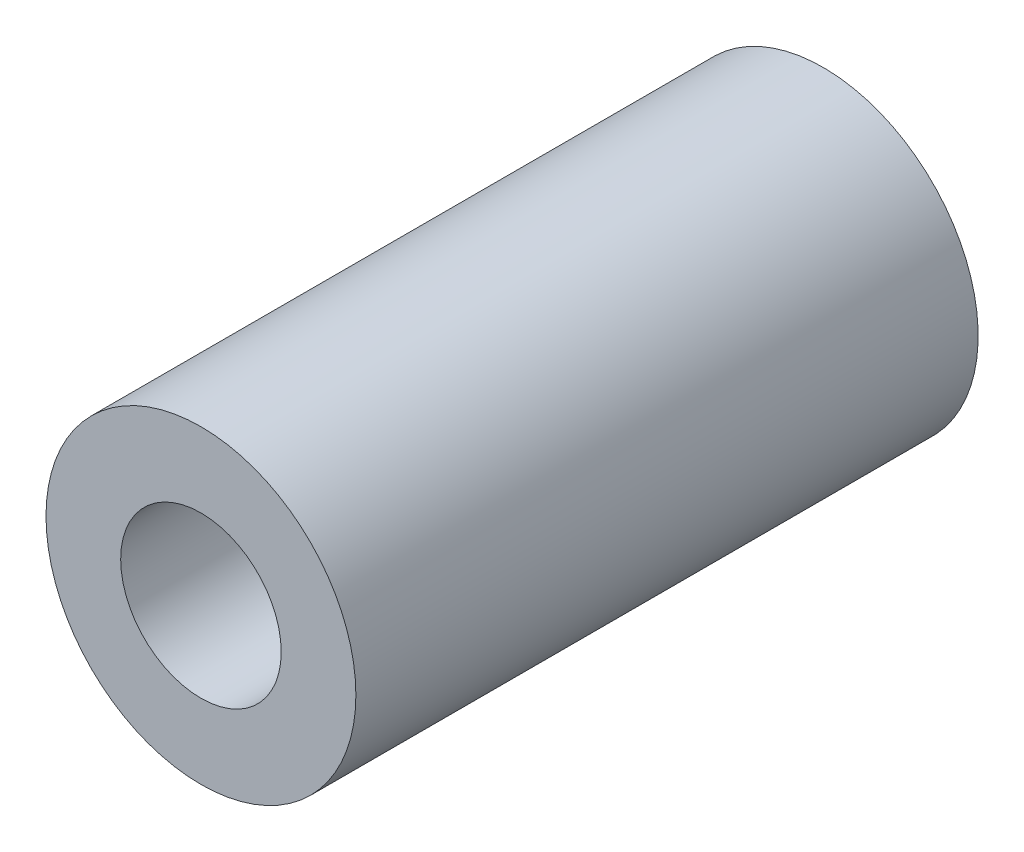
ISO-10303-21;
HEADER;
FILE_DESCRIPTION(('STEP AP214'),'2;1');
FILE_NAME('part.step','',(''),(''),'','','');
FILE_SCHEMA(('AUTOMOTIVE_DESIGN { 1 0 10303 214 1 1 1 1 }'));
ENDSEC;
DATA;
#1=APPLICATION_CONTEXT('core data for automotive mechanical design processes');
#2=APPLICATION_PROTOCOL_DEFINITION('international standard','automotive_design',2000,#1);
#3=PRODUCT_CONTEXT('',#1,'mechanical');
#4=PRODUCT('Part','Part','',(#3));
#5=PRODUCT_RELATED_PRODUCT_CATEGORY('part','',(#4));
#6=PRODUCT_DEFINITION_FORMATION('','',#4);
#7=PRODUCT_DEFINITION_CONTEXT('part definition',#1,'design');
#8=PRODUCT_DEFINITION('design','',#6,#7);
#9=PRODUCT_DEFINITION_SHAPE('','',#8);
#10=(LENGTH_UNIT() NAMED_UNIT(*) SI_UNIT(.MILLI.,.METRE.));
#11=(NAMED_UNIT(*) PLANE_ANGLE_UNIT() SI_UNIT($,.RADIAN.));
#12=(NAMED_UNIT(*) SI_UNIT($,.STERADIAN.) SOLID_ANGLE_UNIT());
#13=UNCERTAINTY_MEASURE_WITH_UNIT(LENGTH_MEASURE(1.E-05),#10,'distance_accuracy_value','');
#14=(GEOMETRIC_REPRESENTATION_CONTEXT(3) GLOBAL_UNCERTAINTY_ASSIGNED_CONTEXT((#13)) GLOBAL_UNIT_ASSIGNED_CONTEXT((#10,
#11,#12)) REPRESENTATION_CONTEXT('',''));
#15=CARTESIAN_POINT('',(0.,0.,0.));
#16=DIRECTION('',(0.,0.,1.));
#17=DIRECTION('',(1.,0.,0.));
#18=AXIS2_PLACEMENT_3D('',#15,#16,#17);
#19=CARTESIAN_POINT('',(0.,0.,228.6));
#20=DIRECTION('',(0.,0.,-1.));
#21=DIRECTION('',(-1.,0.,0.));
#22=AXIS2_PLACEMENT_3D('',#19,#20,#21);
#23=CYLINDRICAL_SURFACE('',#22,3.2766);
#24=CARTESIAN_POINT('',(0.,0.,-228.6));
#25=DIRECTION('',(0.,0.,-1.));
#26=DIRECTION('',(-1.,0.,0.));
#27=AXIS2_PLACEMENT_3D('',#24,#25,#26);
#28=CIRCLE('',#27,3.2766);
#29=CARTESIAN_POINT('',(-3.2766,0.,-228.6));
#30=VERTEX_POINT('',#29);
#31=EDGE_CURVE('E35',#30,#30,#28,.T.);
#32=ORIENTED_EDGE('',*,*,#31,.T.);
#33=EDGE_LOOP('',(#32));
#34=FACE_BOUND('',#33,.T.);
#35=CARTESIAN_POINT('',(0.,0.,-203.2));
#36=DIRECTION('',(0.,0.,1.));
#37=DIRECTION('',(1.,0.,0.));
#38=AXIS2_PLACEMENT_3D('',#35,#36,#37);
#39=CIRCLE('',#38,3.2766);
#40=CARTESIAN_POINT('',(3.2766,0.,-203.2));
#41=VERTEX_POINT('',#40);
#42=EDGE_CURVE('E42',#41,#41,#39,.F.);
#43=ORIENTED_EDGE('',*,*,#42,.F.);
#44=EDGE_LOOP('',(#43));
#45=FACE_BOUND('',#44,.T.);
#46=ADVANCED_FACE('F32',(#34,#45),#23,.F.);
#47=CARTESIAN_POINT('',(0.,0.,228.6));
#48=DIRECTION('',(0.,0.,-1.));
#49=DIRECTION('',(-1.,0.,0.));
#50=AXIS2_PLACEMENT_3D('',#47,#48,#49);
#51=CYLINDRICAL_SURFACE('',#50,6.3246);
#52=CARTESIAN_POINT('',(0.,0.,-228.6));
#53=DIRECTION('',(0.,0.,-1.));
#54=DIRECTION('',(-1.,0.,0.));
#55=AXIS2_PLACEMENT_3D('',#52,#53,#54);
#56=CIRCLE('',#55,6.3246);
#57=CARTESIAN_POINT('',(-6.3246,0.,-228.6));
#58=VERTEX_POINT('',#57);
#59=EDGE_CURVE('E10',#58,#58,#56,.F.);
#60=ORIENTED_EDGE('',*,*,#59,.T.);
#61=EDGE_LOOP('',(#60));
#62=FACE_BOUND('',#61,.T.);
#63=CARTESIAN_POINT('',(0.,0.,-203.2));
#64=DIRECTION('',(0.,0.,1.));
#65=DIRECTION('',(1.,0.,0.));
#66=AXIS2_PLACEMENT_3D('',#63,#64,#65);
#67=CIRCLE('',#66,6.3246);
#68=CARTESIAN_POINT('',(6.3246,0.,-203.2));
#69=VERTEX_POINT('',#68);
#70=EDGE_CURVE('E46',#69,#69,#67,.T.);
#71=ORIENTED_EDGE('',*,*,#70,.F.);
#72=EDGE_LOOP('',(#71));
#73=FACE_BOUND('',#72,.T.);
#74=ADVANCED_FACE('F53',(#62,#73),#51,.T.);
#75=CARTESIAN_POINT('',(0.,0.,-228.6));
#76=DIRECTION('',(0.,0.,1.));
#77=DIRECTION('',(1.,0.,0.));
#78=AXIS2_PLACEMENT_3D('',#75,#76,#77);
#79=PLANE('',#78);
#80=ORIENTED_EDGE('',*,*,#31,.F.);
#81=EDGE_LOOP('',(#80));
#82=FACE_BOUND('',#81,.T.);
#83=ORIENTED_EDGE('',*,*,#59,.F.);
#84=EDGE_LOOP('',(#83));
#85=FACE_BOUND('',#84,.T.);
#86=ADVANCED_FACE('F55',(#82,#85),#79,.F.);
#87=CARTESIAN_POINT('',(0.,0.,-203.2));
#88=DIRECTION('',(0.,0.,1.));
#89=DIRECTION('',(1.,0.,0.));
#90=AXIS2_PLACEMENT_3D('',#87,#88,#89);
#91=PLANE('',#90);
#92=ORIENTED_EDGE('',*,*,#70,.T.);
#93=EDGE_LOOP('',(#92));
#94=FACE_BOUND('',#93,.T.);
#95=ORIENTED_EDGE('',*,*,#42,.T.);
#96=EDGE_LOOP('',(#95));
#97=FACE_BOUND('',#96,.T.);
#98=ADVANCED_FACE('F50',(#94,#97),#91,.T.);
#99=CLOSED_SHELL('',(#46,#74,#86,#98));
#100=MANIFOLD_SOLID_BREP('B2',#99);
#101=ADVANCED_BREP_SHAPE_REPRESENTATION('',(#18,#100),#14);
#102=SHAPE_DEFINITION_REPRESENTATION(#9,#101);
ENDSEC;
END-ISO-10303-21;
